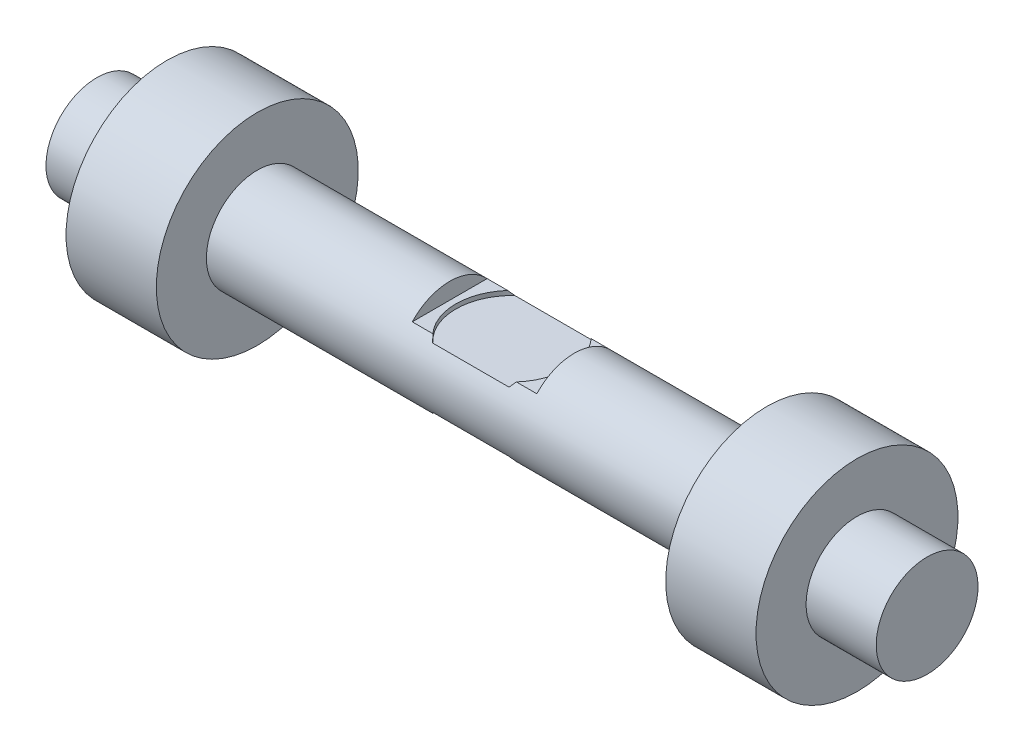
ISO-10303-21;
HEADER;
FILE_DESCRIPTION(('STEP AP214'),'2;1');
FILE_NAME('part.step','',(''),(''),'','','');
FILE_SCHEMA(('AUTOMOTIVE_DESIGN { 1 0 10303 214 1 1 1 1 }'));
ENDSEC;
DATA;
#1=APPLICATION_CONTEXT('core data for automotive mechanical design processes');
#2=APPLICATION_PROTOCOL_DEFINITION('international standard','automotive_design',2000,#1);
#3=PRODUCT_CONTEXT('',#1,'mechanical');
#4=PRODUCT('Part','Part','',(#3));
#5=PRODUCT_RELATED_PRODUCT_CATEGORY('part','',(#4));
#6=PRODUCT_DEFINITION_FORMATION('','',#4);
#7=PRODUCT_DEFINITION_CONTEXT('part definition',#1,'design');
#8=PRODUCT_DEFINITION('design','',#6,#7);
#9=PRODUCT_DEFINITION_SHAPE('','',#8);
#10=(LENGTH_UNIT() NAMED_UNIT(*) SI_UNIT(.MILLI.,.METRE.));
#11=(NAMED_UNIT(*) PLANE_ANGLE_UNIT() SI_UNIT($,.RADIAN.));
#12=(NAMED_UNIT(*) SI_UNIT($,.STERADIAN.) SOLID_ANGLE_UNIT());
#13=UNCERTAINTY_MEASURE_WITH_UNIT(LENGTH_MEASURE(1.E-05),#10,'distance_accuracy_value','');
#14=(GEOMETRIC_REPRESENTATION_CONTEXT(3) GLOBAL_UNCERTAINTY_ASSIGNED_CONTEXT((#13)) GLOBAL_UNIT_ASSIGNED_CONTEXT((#10,
#11,#12)) REPRESENTATION_CONTEXT('',''));
#15=CARTESIAN_POINT('',(0.,0.,0.));
#16=DIRECTION('',(0.,0.,1.));
#17=DIRECTION('',(1.,0.,0.));
#18=AXIS2_PLACEMENT_3D('',#15,#16,#17);
#19=CARTESIAN_POINT('',(0.,0.,0.));
#20=DIRECTION('',(-1.,0.,0.));
#21=DIRECTION('',(0.,-1.,0.));
#22=AXIS2_PLACEMENT_3D('',#19,#20,#21);
#23=CYLINDRICAL_SURFACE('',#22,113.414392954257);
#24=DIRECTION('',(-1.,0.,0.));
#25=VECTOR('',#24,1.);
#26=CARTESIAN_POINT('',(0.,66.8287859085139,-91.6337159738528));
#27=LINE('',#26,#25);
#28=CARTESIAN_POINT('',(1010.01918663939,66.8287859085139,-91.6337159738528));
#29=VERTEX_POINT('',#28);
#30=CARTESIAN_POINT('',(839.980813360611,66.8287859085139,-91.6337159738528));
#31=VERTEX_POINT('',#30);
#32=EDGE_CURVE('E186',#29,#31,#27,.T.);
#33=ORIENTED_EDGE('',*,*,#32,.F.);
#34=CARTESIAN_POINT('',(1010.01918663939,66.8287859085139,-91.6337159738528));
#35=CARTESIAN_POINT('',(1010.70074605879,67.6958340397092,-91.0013608827416));
#36=CARTESIAN_POINT('',(1011.38087128465,68.5546652816579,-90.3561740734483));
#37=CARTESIAN_POINT('',(1012.73653346026,70.2551641641185,-89.0403960319995));
#38=CARTESIAN_POINT('',(1013.41207296136,71.0968419788035,-88.36982057554));
#39=CARTESIAN_POINT('',(1014.75768373868,72.7633690570592,-87.0027479676869));
#40=CARTESIAN_POINT('',(1015.42775498868,73.5882182400087,-86.3062506921544));
#41=CARTESIAN_POINT('',(1016.76158655734,75.2212380756068,-84.8867509976823));
#42=CARTESIAN_POINT('',(1017.42534276375,76.0293982145586,-84.1637326220982));
#43=CARTESIAN_POINT('',(1018.08511059774,76.8287859085139,-83.4275864747773));
#44=B_SPLINE_CURVE_WITH_KNOTS('',3,(#34,#35,#36,#37,#38,#39,#40,#41,#42,#43),.UNSPECIFIED.,.F.,
.F.,(4,2,2,2,4),(0.,3.81378045027927,7.6252288269236,11.4366954588224,15.2504941682873),.UNSPECIFIED.);
#45=CARTESIAN_POINT('',(1018.08511059774,76.8287859085139,-83.4275864747773));
#46=VERTEX_POINT('',#45);
#47=EDGE_CURVE('E258',#29,#46,#44,.T.);
#48=ORIENTED_EDGE('',*,*,#47,.T.);
#49=DIRECTION('',(-1.,0.,0.));
#50=VECTOR('',#49,1.);
#51=CARTESIAN_POINT('',(0.,76.8287859085139,-83.4275864747773));
#52=LINE('',#51,#50);
#53=CARTESIAN_POINT('',(1063.77551020408,76.8287859085139,-83.4275864747773));
#54=VERTEX_POINT('',#53);
#55=EDGE_CURVE('E217',#46,#54,#52,.F.);
#56=ORIENTED_EDGE('',*,*,#55,.T.);
#57=CARTESIAN_POINT('',(1063.77551020408,0.,0.));
#58=DIRECTION('',(1.,0.,0.));
#59=DIRECTION('',(0.,0.,-1.));
#60=AXIS2_PLACEMENT_3D('',#57,#58,#59);
#61=CIRCLE('',#60,113.414392954257);
#62=CARTESIAN_POINT('',(1063.77551020408,76.8287859085139,83.4275864747773));
#63=VERTEX_POINT('',#62);
#64=EDGE_CURVE('E211',#54,#63,#61,.T.);
#65=ORIENTED_EDGE('',*,*,#64,.T.);
#66=DIRECTION('',(-1.,0.,0.));
#67=VECTOR('',#66,1.);
#68=CARTESIAN_POINT('',(0.,76.8287859085139,83.4275864747773));
#69=LINE('',#68,#67);
#70=CARTESIAN_POINT('',(1018.08511059774,76.8287859085139,83.4275864747773));
#71=VERTEX_POINT('',#70);
#72=EDGE_CURVE('E204',#63,#71,#69,.T.);
#73=ORIENTED_EDGE('',*,*,#72,.T.);
#74=CARTESIAN_POINT('',(1018.08511059774,76.8287859085139,83.4275864747773));
#75=CARTESIAN_POINT('',(1017.42534276375,76.0293982145586,84.1637326220982));
#76=CARTESIAN_POINT('',(1016.76158655734,75.2212380756068,84.8867509976823));
#77=CARTESIAN_POINT('',(1015.42775498868,73.5882182400088,86.3062506921544));
#78=CARTESIAN_POINT('',(1014.75768373868,72.7633690570592,87.0027479676868));
#79=CARTESIAN_POINT('',(1013.41207296136,71.0968419788035,88.36982057554));
#80=CARTESIAN_POINT('',(1012.73653346026,70.2551641641185,89.0403960319994));
#81=CARTESIAN_POINT('',(1011.38087128465,68.5546652816579,90.3561740734483));
#82=CARTESIAN_POINT('',(1010.70074605879,67.6958340397092,91.0013608827416));
#83=CARTESIAN_POINT('',(1010.01918663939,66.8287859085139,91.6337159738527));
#84=B_SPLINE_CURVE_WITH_KNOTS('',3,(#74,#75,#76,#77,#78,#79,#80,#81,#82,#83),.UNSPECIFIED.,.F.,
.F.,(4,2,2,2,4),(0.,3.81379870946459,7.62526534136366,11.436713718008,15.2504941682872),.UNSPECIFIED.);
#85=CARTESIAN_POINT('',(1010.01918663939,66.8287859085139,91.6337159738528));
#86=VERTEX_POINT('',#85);
#87=EDGE_CURVE('E282',#71,#86,#84,.T.);
#88=ORIENTED_EDGE('',*,*,#87,.T.);
#89=DIRECTION('',(-1.,0.,0.));
#90=VECTOR('',#89,1.);
#91=CARTESIAN_POINT('',(0.,66.8287859085139,91.6337159738528));
#92=LINE('',#91,#90);
#93=CARTESIAN_POINT('',(839.980813360611,66.8287859085139,91.6337159738528));
#94=VERTEX_POINT('',#93);
#95=EDGE_CURVE('E190',#94,#86,#92,.F.);
#96=ORIENTED_EDGE('',*,*,#95,.F.);
#97=CARTESIAN_POINT('',(839.980813360611,66.8287859085139,91.6337159738528));
#98=CARTESIAN_POINT('',(839.299253941214,67.6958340397091,91.0013608827417));
#99=CARTESIAN_POINT('',(838.619128715354,68.5546652816579,90.3561740734483));
#100=CARTESIAN_POINT('',(837.263466539745,70.2551641641185,89.0403960319995));
#101=CARTESIAN_POINT('',(836.587927038638,71.0968419788035,88.36982057554));
#102=CARTESIAN_POINT('',(835.24231626132,72.7633690570592,87.0027479676868));
#103=CARTESIAN_POINT('',(834.572245011316,73.5882182400088,86.3062506921544));
#104=CARTESIAN_POINT('',(833.238413442657,75.2212380756068,84.8867509976823));
#105=CARTESIAN_POINT('',(832.574657236253,76.0293982145586,84.1637326220982));
#106=CARTESIAN_POINT('',(831.91488940226,76.8287859085139,83.4275864747773));
#107=B_SPLINE_CURVE_WITH_KNOTS('',3,(#97,#98,#99,#100,#101,#102,#103,#104,#105,#106),
.UNSPECIFIED.,.F.,.F.,(4,2,2,2,4),(0.,3.81378045027925,7.62522882692358,11.4366954588227,
15.2504941682874),.UNSPECIFIED.);
#108=CARTESIAN_POINT('',(831.91488940226,76.8287859085139,83.4275864747773));
#109=VERTEX_POINT('',#108);
#110=EDGE_CURVE('E266',#94,#109,#107,.T.);
#111=ORIENTED_EDGE('',*,*,#110,.T.);
#112=CARTESIAN_POINT('',(786.224489795919,76.8287859085139,83.4275864747773));
#113=VERTEX_POINT('',#112);
#114=EDGE_CURVE('E207',#109,#113,#69,.T.);
#115=ORIENTED_EDGE('',*,*,#114,.T.);
#116=CARTESIAN_POINT('',(786.224489795919,0.,0.));
#117=DIRECTION('',(-1.,0.,0.));
#118=DIRECTION('',(0.,0.,1.));
#119=AXIS2_PLACEMENT_3D('',#116,#117,#118);
#120=CIRCLE('',#119,113.414392954257);
#121=CARTESIAN_POINT('',(786.224489795919,76.8287859085139,-83.4275864747773));
#122=VERTEX_POINT('',#121);
#123=EDGE_CURVE('E208',#113,#122,#120,.T.);
#124=ORIENTED_EDGE('',*,*,#123,.T.);
#125=CARTESIAN_POINT('',(831.91488940226,76.8287859085139,-83.4275864747773));
#126=VERTEX_POINT('',#125);
#127=EDGE_CURVE('E214',#122,#126,#52,.F.);
#128=ORIENTED_EDGE('',*,*,#127,.T.);
#129=CARTESIAN_POINT('',(831.91488940226,76.8287859085139,-83.4275864747773));
#130=CARTESIAN_POINT('',(832.574657236254,76.0293982145585,-84.1637326220983));
#131=CARTESIAN_POINT('',(833.238413442657,75.2212380756067,-84.8867509976824));
#132=CARTESIAN_POINT('',(834.572245011316,73.5882182400086,-86.3062506921545));
#133=CARTESIAN_POINT('',(835.24231626132,72.7633690570591,-87.0027479676869));
#134=CARTESIAN_POINT('',(836.587927038638,71.0968419788035,-88.3698205755401));
#135=CARTESIAN_POINT('',(837.263466539745,70.2551641641184,-89.0403960319996));
#136=CARTESIAN_POINT('',(838.619128715354,68.5546652816578,-90.3561740734484));
#137=CARTESIAN_POINT('',(839.299253941214,67.695834039709,-91.0013608827417));
#138=CARTESIAN_POINT('',(839.980813360611,66.8287859085138,-91.6337159738528));
#139=B_SPLINE_CURVE_WITH_KNOTS('',3,(#129,#130,#131,#132,#133,#134,#135,#136,#137,#138),
.UNSPECIFIED.,.F.,.F.,(4,2,2,2,4),(0.,3.8137987094648,7.62526534136389,11.4367137180082,
15.2504941682874),.UNSPECIFIED.);
#140=EDGE_CURVE('E56',#126,#31,#139,.T.);
#141=ORIENTED_EDGE('',*,*,#140,.T.);
#142=EDGE_LOOP('',(#33,#48,#56,#65,#73,#88,#96,#111,#115,#124,#128,#141));
#143=FACE_BOUND('',#142,.T.);
#144=CARTESIAN_POINT('',(357.447453169857,0.,0.));
#145=DIRECTION('',(-1.,0.,0.));
#146=DIRECTION('',(0.,-1.,0.));
#147=AXIS2_PLACEMENT_3D('',#144,#145,#146);
#148=CIRCLE('',#147,113.414392954257);
#149=CARTESIAN_POINT('',(357.447453169857,-113.414392954257,0.));
#150=VERTEX_POINT('',#149);
#151=EDGE_CURVE('E230',#150,#150,#148,.T.);
#152=ORIENTED_EDGE('',*,*,#151,.F.);
#153=EDGE_LOOP('',(#152));
#154=FACE_BOUND('',#153,.T.);
#155=CARTESIAN_POINT('',(1492.55254683014,0.,0.));
#156=DIRECTION('',(-1.,0.,0.));
#157=DIRECTION('',(0.,-1.,0.));
#158=AXIS2_PLACEMENT_3D('',#155,#156,#157);
#159=CIRCLE('',#158,113.414392954257);
#160=CARTESIAN_POINT('',(1492.55254683014,-113.414392954257,0.));
#161=VERTEX_POINT('',#160);
#162=EDGE_CURVE('E233',#161,#161,#159,.T.);
#163=ORIENTED_EDGE('',*,*,#162,.T.);
#164=EDGE_LOOP('',(#163));
#165=FACE_BOUND('',#164,.T.);
#166=CARTESIAN_POINT('',(839.980813360611,-66.8287859085139,91.6337159738528));
#167=CARTESIAN_POINT('',(839.299253941214,-67.6958340397091,91.0013608827417));
#168=CARTESIAN_POINT('',(838.619128715354,-68.5546652816579,90.3561740734483));
#169=CARTESIAN_POINT('',(837.263466539745,-70.2551641641185,89.0403960319995));
#170=CARTESIAN_POINT('',(836.587927038638,-71.0968419788035,88.36982057554));
#171=CARTESIAN_POINT('',(835.24231626132,-72.7633690570592,87.0027479676868));
#172=CARTESIAN_POINT('',(834.572245011316,-73.5882182400088,86.3062506921544));
#173=CARTESIAN_POINT('',(833.238413442657,-75.2212380756068,84.8867509976823));
#174=CARTESIAN_POINT('',(832.574657236253,-76.0293982145586,84.1637326220982));
#175=CARTESIAN_POINT('',(831.91488940226,-76.8287859085139,83.4275864747773));
#176=B_SPLINE_CURVE_WITH_KNOTS('',3,(#166,#167,#168,#169,#170,#171,#172,#173,#174,#175),
.UNSPECIFIED.,.F.,.F.,(4,2,2,2,4),(0.,3.81378045027925,7.62522882692358,11.4366954588227,
15.2504941682874),.UNSPECIFIED.);
#177=CARTESIAN_POINT('',(839.980813360611,-66.8287859085139,91.6337159738528));
#178=VERTEX_POINT('',#177);
#179=CARTESIAN_POINT('',(831.91488940226,-76.8287859085139,83.4275864747773));
#180=VERTEX_POINT('',#179);
#181=EDGE_CURVE('E140',#178,#180,#176,.T.);
#182=ORIENTED_EDGE('',*,*,#181,.F.);
#183=DIRECTION('',(-1.,0.,0.));
#184=VECTOR('',#183,1.);
#185=CARTESIAN_POINT('',(0.,-66.8287859085139,91.6337159738528));
#186=LINE('',#185,#184);
#187=CARTESIAN_POINT('',(1010.01918663939,-66.8287859085139,91.6337159738528));
#188=VERTEX_POINT('',#187);
#189=EDGE_CURVE('E11',#188,#178,#186,.T.);
#190=ORIENTED_EDGE('',*,*,#189,.F.);
#191=CARTESIAN_POINT('',(1018.08511059774,-76.8287859085139,83.4275864747773));
#192=CARTESIAN_POINT('',(1017.42534276375,-76.0293982145586,84.1637326220982));
#193=CARTESIAN_POINT('',(1016.76158655734,-75.2212380756068,84.8867509976823));
#194=CARTESIAN_POINT('',(1015.42775498868,-73.5882182400088,86.3062506921544));
#195=CARTESIAN_POINT('',(1014.75768373868,-72.7633690570592,87.0027479676868));
#196=CARTESIAN_POINT('',(1013.41207296136,-71.0968419788036,88.36982057554));
#197=CARTESIAN_POINT('',(1012.73653346026,-70.2551641641185,89.0403960319994));
#198=CARTESIAN_POINT('',(1011.38087128465,-68.5546652816579,90.3561740734483));
#199=CARTESIAN_POINT('',(1010.70074605879,-67.6958340397092,91.0013608827416));
#200=CARTESIAN_POINT('',(1010.01918663939,-66.8287859085139,91.6337159738527));
#201=B_SPLINE_CURVE_WITH_KNOTS('',3,(#191,#192,#193,#194,#195,#196,#197,#198,#199,#200),
.UNSPECIFIED.,.F.,.F.,(4,2,2,2,4),(0.,3.81379870946457,7.62526534136364,11.436713718008,
15.2504941682872),.UNSPECIFIED.);
#202=CARTESIAN_POINT('',(1018.08511059774,-76.8287859085139,83.4275864747773));
#203=VERTEX_POINT('',#202);
#204=EDGE_CURVE('E121',#203,#188,#201,.T.);
#205=ORIENTED_EDGE('',*,*,#204,.F.);
#206=DIRECTION('',(-1.,0.,0.));
#207=VECTOR('',#206,1.);
#208=CARTESIAN_POINT('',(0.,-76.8287859085139,83.4275864747773));
#209=LINE('',#208,#207);
#210=CARTESIAN_POINT('',(1063.77551020408,-76.8287859085139,83.4275864747773));
#211=VERTEX_POINT('',#210);
#212=EDGE_CURVE('E203',#203,#211,#209,.F.);
#213=ORIENTED_EDGE('',*,*,#212,.T.);
#214=CARTESIAN_POINT('',(1063.77551020408,0.,0.));
#215=DIRECTION('',(1.,0.,0.));
#216=DIRECTION('',(0.,0.,-1.));
#217=AXIS2_PLACEMENT_3D('',#214,#215,#216);
#218=CIRCLE('',#217,113.414392954257);
#219=CARTESIAN_POINT('',(1063.77551020408,-76.8287859085139,-83.4275864747773));
#220=VERTEX_POINT('',#219);
#221=EDGE_CURVE('E197',#211,#220,#218,.T.);
#222=ORIENTED_EDGE('',*,*,#221,.T.);
#223=DIRECTION('',(-1.,0.,0.));
#224=VECTOR('',#223,1.);
#225=CARTESIAN_POINT('',(0.,-76.8287859085139,-83.4275864747773));
#226=LINE('',#225,#224);
#227=CARTESIAN_POINT('',(1018.08511059774,-76.8287859085139,-83.4275864747773));
#228=VERTEX_POINT('',#227);
#229=EDGE_CURVE('E194',#220,#228,#226,.T.);
#230=ORIENTED_EDGE('',*,*,#229,.T.);
#231=CARTESIAN_POINT('',(1010.01918663939,-66.8287859085139,-91.6337159738528));
#232=CARTESIAN_POINT('',(1010.70074605879,-67.6958340397092,-91.0013608827417));
#233=CARTESIAN_POINT('',(1011.38087128465,-68.5546652816579,-90.3561740734483));
#234=CARTESIAN_POINT('',(1012.73653346026,-70.2551641641185,-89.0403960319995));
#235=CARTESIAN_POINT('',(1013.41207296136,-71.0968419788035,-88.36982057554));
#236=CARTESIAN_POINT('',(1014.75768373868,-72.7633690570592,-87.0027479676868));
#237=CARTESIAN_POINT('',(1015.42775498868,-73.5882182400088,-86.3062506921544));
#238=CARTESIAN_POINT('',(1016.76158655734,-75.2212380756068,-84.8867509976823));
#239=CARTESIAN_POINT('',(1017.42534276375,-76.0293982145586,-84.1637326220982));
#240=CARTESIAN_POINT('',(1018.08511059774,-76.8287859085139,-83.4275864747773));
#241=B_SPLINE_CURVE_WITH_KNOTS('',3,(#231,#232,#233,#234,#235,#236,#237,#238,#239,#240),
.UNSPECIFIED.,.F.,.F.,(4,2,2,2,4),(0.,3.81378045027928,7.62522882692361,11.4366954588227,
15.2504941682873),.UNSPECIFIED.);
#242=CARTESIAN_POINT('',(1010.01918663939,-66.8287859085139,-91.6337159738528));
#243=VERTEX_POINT('',#242);
#244=EDGE_CURVE('E48',#243,#228,#241,.T.);
#245=ORIENTED_EDGE('',*,*,#244,.F.);
#246=DIRECTION('',(-1.,0.,0.));
#247=VECTOR('',#246,1.);
#248=CARTESIAN_POINT('',(0.,-66.8287859085139,-91.6337159738528));
#249=LINE('',#248,#247);
#250=CARTESIAN_POINT('',(839.980813360611,-66.8287859085139,-91.6337159738528));
#251=VERTEX_POINT('',#250);
#252=EDGE_CURVE('E41',#251,#243,#249,.F.);
#253=ORIENTED_EDGE('',*,*,#252,.F.);
#254=CARTESIAN_POINT('',(831.91488940226,-76.8287859085139,-83.4275864747773));
#255=CARTESIAN_POINT('',(832.574657236254,-76.0293982145585,-84.1637326220983));
#256=CARTESIAN_POINT('',(833.238413442657,-75.2212380756067,-84.8867509976824));
#257=CARTESIAN_POINT('',(834.572245011316,-73.5882182400086,-86.3062506921545));
#258=CARTESIAN_POINT('',(835.24231626132,-72.7633690570591,-87.0027479676869));
#259=CARTESIAN_POINT('',(836.587927038638,-71.0968419788035,-88.3698205755401));
#260=CARTESIAN_POINT('',(837.263466539745,-70.2551641641184,-89.0403960319996));
#261=CARTESIAN_POINT('',(838.619128715354,-68.5546652816578,-90.3561740734484));
#262=CARTESIAN_POINT('',(839.299253941214,-67.695834039709,-91.0013608827417));
#263=CARTESIAN_POINT('',(839.980813360611,-66.8287859085138,-91.6337159738528));
#264=B_SPLINE_CURVE_WITH_KNOTS('',3,(#254,#255,#256,#257,#258,#259,#260,#261,#262,#263),
.UNSPECIFIED.,.F.,.F.,(4,2,2,2,4),(0.,3.8137987094648,7.62526534136389,11.4367137180082,
15.2504941682874),.UNSPECIFIED.);
#265=CARTESIAN_POINT('',(831.91488940226,-76.8287859085139,-83.4275864747773));
#266=VERTEX_POINT('',#265);
#267=EDGE_CURVE('E129',#266,#251,#264,.T.);
#268=ORIENTED_EDGE('',*,*,#267,.F.);
#269=CARTESIAN_POINT('',(786.224489795919,-76.8287859085139,-83.4275864747773));
#270=VERTEX_POINT('',#269);
#271=EDGE_CURVE('E196',#266,#270,#226,.T.);
#272=ORIENTED_EDGE('',*,*,#271,.T.);
#273=CARTESIAN_POINT('',(786.224489795919,0.,0.));
#274=DIRECTION('',(-1.,0.,0.));
#275=DIRECTION('',(0.,0.,1.));
#276=AXIS2_PLACEMENT_3D('',#273,#274,#275);
#277=CIRCLE('',#276,113.414392954257);
#278=CARTESIAN_POINT('',(786.224489795919,-76.8287859085139,83.4275864747773));
#279=VERTEX_POINT('',#278);
#280=EDGE_CURVE('E200',#270,#279,#277,.T.);
#281=ORIENTED_EDGE('',*,*,#280,.T.);
#282=EDGE_CURVE('E142',#279,#180,#209,.F.);
#283=ORIENTED_EDGE('',*,*,#282,.T.);
#284=EDGE_LOOP('',(#182,#190,#205,#213,#222,#230,#245,#253,#268,#272,#281,#283));
#285=FACE_BOUND('',#284,.T.);
#286=ADVANCED_FACE('F33',(#143,#154,#165,#285),#23,.T.);
#287=CARTESIAN_POINT('',(1063.77551020408,-76.8287859085139,-225.));
#288=DIRECTION('',(0.,1.,0.));
#289=DIRECTION('',(0.,0.,1.));
#290=AXIS2_PLACEMENT_3D('',#287,#288,#289);
#291=PLANE('',#290);
#292=CARTESIAN_POINT('',(925.,-76.8287859085139,0.));
#293=DIRECTION('',(0.,1.,0.));
#294=DIRECTION('',(0.,0.,1.));
#295=AXIS2_PLACEMENT_3D('',#292,#293,#294);
#296=CIRCLE('',#295,125.);
#297=EDGE_CURVE('E185',#180,#266,#296,.F.);
#298=ORIENTED_EDGE('',*,*,#297,.F.);
#299=ORIENTED_EDGE('',*,*,#282,.F.);
#300=DIRECTION('',(0.,0.,1.));
#301=VECTOR('',#300,1.);
#302=CARTESIAN_POINT('',(786.224489795919,-76.8287859085139,-225.));
#303=LINE('',#302,#301);
#304=EDGE_CURVE('E252',#270,#279,#303,.T.);
#305=ORIENTED_EDGE('',*,*,#304,.F.);
#306=ORIENTED_EDGE('',*,*,#271,.F.);
#307=EDGE_LOOP('',(#298,#299,#305,#306));
#308=FACE_BOUND('',#307,.T.);
#309=ADVANCED_FACE('F323',(#308),#291,.F.);
#310=CARTESIAN_POINT('',(925.,-76.8287859085139,0.));
#311=DIRECTION('',(0.,1.,0.));
#312=DIRECTION('',(0.,0.,1.));
#313=AXIS2_PLACEMENT_3D('',#310,#311,#312);
#314=CIRCLE('',#313,125.);
#315=EDGE_CURVE('E125',#203,#228,#314,.T.);
#316=ORIENTED_EDGE('',*,*,#315,.T.);
#317=ORIENTED_EDGE('',*,*,#229,.F.);
#318=DIRECTION('',(0.,0.,1.));
#319=VECTOR('',#318,1.);
#320=CARTESIAN_POINT('',(1063.77551020408,-76.8287859085139,-225.));
#321=LINE('',#320,#319);
#322=EDGE_CURVE('E255',#220,#211,#321,.T.);
#323=ORIENTED_EDGE('',*,*,#322,.T.);
#324=ORIENTED_EDGE('',*,*,#212,.F.);
#325=EDGE_LOOP('',(#316,#317,#323,#324));
#326=FACE_BOUND('',#325,.T.);
#327=ADVANCED_FACE('F329',(#326),#291,.F.);
#328=CARTESIAN_POINT('',(1063.77551020408,76.8287859085139,-225.));
#329=DIRECTION('',(0.,-1.,0.));
#330=DIRECTION('',(0.,0.,-1.));
#331=AXIS2_PLACEMENT_3D('',#328,#329,#330);
#332=PLANE('',#331);
#333=ORIENTED_EDGE('',*,*,#55,.F.);
#334=CARTESIAN_POINT('',(925.,76.8287859085139,0.));
#335=DIRECTION('',(0.,1.,0.));
#336=DIRECTION('',(0.,0.,1.));
#337=AXIS2_PLACEMENT_3D('',#334,#335,#336);
#338=CIRCLE('',#337,125.);
#339=EDGE_CURVE('E145',#71,#46,#338,.T.);
#340=ORIENTED_EDGE('',*,*,#339,.F.);
#341=ORIENTED_EDGE('',*,*,#72,.F.);
#342=DIRECTION('',(0.,0.,1.));
#343=VECTOR('',#342,1.);
#344=CARTESIAN_POINT('',(1063.77551020408,76.8287859085139,-225.));
#345=LINE('',#344,#343);
#346=EDGE_CURVE('E248',#54,#63,#345,.T.);
#347=ORIENTED_EDGE('',*,*,#346,.F.);
#348=EDGE_LOOP('',(#333,#340,#341,#347));
#349=FACE_BOUND('',#348,.T.);
#350=ADVANCED_FACE('F333',(#349),#332,.F.);
#351=CARTESIAN_POINT('',(0.,0.,0.));
#352=DIRECTION('',(1.,0.,0.));
#353=DIRECTION('',(0.,1.,0.));
#354=AXIS2_PLACEMENT_3D('',#351,#352,#353);
#355=PLANE('',#354);
#356=CARTESIAN_POINT('',(0.,0.,0.));
#357=DIRECTION('',(-1.,0.,0.));
#358=DIRECTION('',(0.,-1.,0.));
#359=AXIS2_PLACEMENT_3D('',#356,#357,#358);
#360=CIRCLE('',#359,113.414392954257);
#361=CARTESIAN_POINT('',(0.,-113.414392954257,0.));
#362=VERTEX_POINT('',#361);
#363=EDGE_CURVE('E218',#362,#362,#360,.T.);
#364=ORIENTED_EDGE('',*,*,#363,.T.);
#365=EDGE_LOOP('',(#364));
#366=FACE_BOUND('',#365,.T.);
#367=ADVANCED_FACE('F35',(#366),#355,.F.);
#368=CARTESIAN_POINT('',(0.,0.,0.));
#369=DIRECTION('',(-1.,0.,0.));
#370=DIRECTION('',(0.,-1.,0.));
#371=AXIS2_PLACEMENT_3D('',#368,#369,#370);
#372=CYLINDRICAL_SURFACE('',#371,113.414392954257);
#373=ORIENTED_EDGE('',*,*,#363,.F.);
#374=EDGE_LOOP('',(#373));
#375=FACE_BOUND('',#374,.T.);
#376=CARTESIAN_POINT('',(156.301438495659,0.,0.));
#377=DIRECTION('',(-1.,0.,0.));
#378=DIRECTION('',(0.,-1.,0.));
#379=AXIS2_PLACEMENT_3D('',#376,#377,#378);
#380=CIRCLE('',#379,113.414392954257);
#381=CARTESIAN_POINT('',(156.301438495659,-113.414392954257,0.));
#382=VERTEX_POINT('',#381);
#383=EDGE_CURVE('E221',#382,#382,#380,.T.);
#384=ORIENTED_EDGE('',*,*,#383,.T.);
#385=EDGE_LOOP('',(#384));
#386=FACE_BOUND('',#385,.T.);
#387=ADVANCED_FACE('F345',(#375,#386),#372,.T.);
#388=CARTESIAN_POINT('',(156.301438495659,113.414392954257,0.));
#389=DIRECTION('',(1.,0.,0.));
#390=DIRECTION('',(0.,1.,0.));
#391=AXIS2_PLACEMENT_3D('',#388,#389,#390);
#392=PLANE('',#391);
#393=ORIENTED_EDGE('',*,*,#383,.F.);
#394=EDGE_LOOP('',(#393));
#395=FACE_BOUND('',#394,.T.);
#396=CARTESIAN_POINT('',(156.301438495659,0.,0.));
#397=DIRECTION('',(-1.,0.,0.));
#398=DIRECTION('',(0.,-1.,0.));
#399=AXIS2_PLACEMENT_3D('',#396,#397,#398);
#400=CIRCLE('',#399,225.);
#401=CARTESIAN_POINT('',(156.301438495659,-225.,0.));
#402=VERTEX_POINT('',#401);
#403=EDGE_CURVE('E224',#402,#402,#400,.T.);
#404=ORIENTED_EDGE('',*,*,#403,.T.);
#405=EDGE_LOOP('',(#404));
#406=FACE_BOUND('',#405,.T.);
#407=ADVANCED_FACE('F354',(#395,#406),#392,.F.);
#408=CARTESIAN_POINT('',(0.,0.,0.));
#409=DIRECTION('',(-1.,0.,0.));
#410=DIRECTION('',(0.,-1.,0.));
#411=AXIS2_PLACEMENT_3D('',#408,#409,#410);
#412=CYLINDRICAL_SURFACE('',#411,225.);
#413=ORIENTED_EDGE('',*,*,#403,.F.);
#414=EDGE_LOOP('',(#413));
#415=FACE_BOUND('',#414,.T.);
#416=CARTESIAN_POINT('',(357.447453169857,0.,0.));
#417=DIRECTION('',(-1.,0.,0.));
#418=DIRECTION('',(0.,-1.,0.));
#419=AXIS2_PLACEMENT_3D('',#416,#417,#418);
#420=CIRCLE('',#419,225.);
#421=CARTESIAN_POINT('',(357.447453169857,-225.,0.));
#422=VERTEX_POINT('',#421);
#423=EDGE_CURVE('E227',#422,#422,#420,.T.);
#424=ORIENTED_EDGE('',*,*,#423,.T.);
#425=EDGE_LOOP('',(#424));
#426=FACE_BOUND('',#425,.T.);
#427=ADVANCED_FACE('F362',(#415,#426),#412,.T.);
#428=CARTESIAN_POINT('',(357.447453169857,225.,0.));
#429=DIRECTION('',(-1.,0.,0.));
#430=DIRECTION('',(0.,-1.,0.));
#431=AXIS2_PLACEMENT_3D('',#428,#429,#430);
#432=PLANE('',#431);
#433=ORIENTED_EDGE('',*,*,#423,.F.);
#434=EDGE_LOOP('',(#433));
#435=FACE_BOUND('',#434,.T.);
#436=ORIENTED_EDGE('',*,*,#151,.T.);
#437=EDGE_LOOP('',(#436));
#438=FACE_BOUND('',#437,.T.);
#439=ADVANCED_FACE('F368',(#435,#438),#432,.F.);
#440=CARTESIAN_POINT('',(1492.55254683014,113.414392954257,0.));
#441=DIRECTION('',(1.,0.,0.));
#442=DIRECTION('',(0.,1.,0.));
#443=AXIS2_PLACEMENT_3D('',#440,#441,#442);
#444=PLANE('',#443);
#445=ORIENTED_EDGE('',*,*,#162,.F.);
#446=EDGE_LOOP('',(#445));
#447=FACE_BOUND('',#446,.T.);
#448=CARTESIAN_POINT('',(1492.55254683014,0.,0.));
#449=DIRECTION('',(-1.,0.,0.));
#450=DIRECTION('',(0.,-1.,0.));
#451=AXIS2_PLACEMENT_3D('',#448,#449,#450);
#452=CIRCLE('',#451,225.);
#453=CARTESIAN_POINT('',(1492.55254683014,-225.,0.));
#454=VERTEX_POINT('',#453);
#455=EDGE_CURVE('E236',#454,#454,#452,.T.);
#456=ORIENTED_EDGE('',*,*,#455,.T.);
#457=EDGE_LOOP('',(#456));
#458=FACE_BOUND('',#457,.T.);
#459=ADVANCED_FACE('F374',(#447,#458),#444,.F.);
#460=CARTESIAN_POINT('',(0.,0.,0.));
#461=DIRECTION('',(-1.,0.,0.));
#462=DIRECTION('',(0.,-1.,0.));
#463=AXIS2_PLACEMENT_3D('',#460,#461,#462);
#464=CYLINDRICAL_SURFACE('',#463,225.);
#465=ORIENTED_EDGE('',*,*,#455,.F.);
#466=EDGE_LOOP('',(#465));
#467=FACE_BOUND('',#466,.T.);
#468=CARTESIAN_POINT('',(1693.69856150434,0.,0.));
#469=DIRECTION('',(-1.,0.,0.));
#470=DIRECTION('',(0.,-1.,0.));
#471=AXIS2_PLACEMENT_3D('',#468,#469,#470);
#472=CIRCLE('',#471,225.);
#473=CARTESIAN_POINT('',(1693.69856150434,-225.,0.));
#474=VERTEX_POINT('',#473);
#475=EDGE_CURVE('E239',#474,#474,#472,.T.);
#476=ORIENTED_EDGE('',*,*,#475,.T.);
#477=EDGE_LOOP('',(#476));
#478=FACE_BOUND('',#477,.T.);
#479=ADVANCED_FACE('F381',(#467,#478),#464,.T.);
#480=CARTESIAN_POINT('',(1693.69856150434,225.,0.));
#481=DIRECTION('',(-1.,0.,0.));
#482=DIRECTION('',(0.,-1.,0.));
#483=AXIS2_PLACEMENT_3D('',#480,#481,#482);
#484=PLANE('',#483);
#485=ORIENTED_EDGE('',*,*,#475,.F.);
#486=EDGE_LOOP('',(#485));
#487=FACE_BOUND('',#486,.T.);
#488=CARTESIAN_POINT('',(1693.69856150434,0.,0.));
#489=DIRECTION('',(-1.,0.,0.));
#490=DIRECTION('',(0.,-1.,0.));
#491=AXIS2_PLACEMENT_3D('',#488,#489,#490);
#492=CIRCLE('',#491,113.414392954257);
#493=CARTESIAN_POINT('',(1693.69856150434,-113.414392954257,0.));
#494=VERTEX_POINT('',#493);
#495=EDGE_CURVE('E242',#494,#494,#492,.T.);
#496=ORIENTED_EDGE('',*,*,#495,.T.);
#497=EDGE_LOOP('',(#496));
#498=FACE_BOUND('',#497,.T.);
#499=ADVANCED_FACE('F386',(#487,#498),#484,.F.);
#500=CARTESIAN_POINT('',(0.,0.,0.));
#501=DIRECTION('',(-1.,0.,0.));
#502=DIRECTION('',(0.,-1.,0.));
#503=AXIS2_PLACEMENT_3D('',#500,#501,#502);
#504=CYLINDRICAL_SURFACE('',#503,113.414392954257);
#505=ORIENTED_EDGE('',*,*,#495,.F.);
#506=EDGE_LOOP('',(#505));
#507=FACE_BOUND('',#506,.T.);
#508=CARTESIAN_POINT('',(1850.,0.,0.));
#509=DIRECTION('',(-1.,0.,0.));
#510=DIRECTION('',(0.,-1.,0.));
#511=AXIS2_PLACEMENT_3D('',#508,#509,#510);
#512=CIRCLE('',#511,113.414392954257);
#513=CARTESIAN_POINT('',(1850.,-113.414392954257,0.));
#514=VERTEX_POINT('',#513);
#515=EDGE_CURVE('E245',#514,#514,#512,.T.);
#516=ORIENTED_EDGE('',*,*,#515,.T.);
#517=EDGE_LOOP('',(#516));
#518=FACE_BOUND('',#517,.T.);
#519=ADVANCED_FACE('F318',(#507,#518),#504,.T.);
#520=CARTESIAN_POINT('',(1850.,113.414392954257,0.));
#521=DIRECTION('',(-1.,0.,0.));
#522=DIRECTION('',(0.,-1.,0.));
#523=AXIS2_PLACEMENT_3D('',#520,#521,#522);
#524=PLANE('',#523);
#525=ORIENTED_EDGE('',*,*,#515,.F.);
#526=EDGE_LOOP('',(#525));
#527=FACE_BOUND('',#526,.T.);
#528=ADVANCED_FACE('F309',(#527),#524,.F.);
#529=CARTESIAN_POINT('',(786.224489795919,76.8287859085139,-225.));
#530=DIRECTION('',(-1.,0.,0.));
#531=DIRECTION('',(0.,0.,1.));
#532=AXIS2_PLACEMENT_3D('',#529,#530,#531);
#533=PLANE('',#532);
#534=DIRECTION('',(0.,0.,1.));
#535=VECTOR('',#534,1.);
#536=CARTESIAN_POINT('',(786.224489795919,76.8287859085139,-225.));
#537=LINE('',#536,#535);
#538=EDGE_CURVE('E249',#122,#113,#537,.T.);
#539=ORIENTED_EDGE('',*,*,#538,.F.);
#540=ORIENTED_EDGE('',*,*,#123,.F.);
#541=EDGE_LOOP('',(#539,#540));
#542=FACE_BOUND('',#541,.T.);
#543=ADVANCED_FACE('F306',(#542),#533,.F.);
#544=CARTESIAN_POINT('',(1063.77551020408,76.8287859085139,-225.));
#545=DIRECTION('',(1.,0.,0.));
#546=DIRECTION('',(0.,0.,-1.));
#547=AXIS2_PLACEMENT_3D('',#544,#545,#546);
#548=PLANE('',#547);
#549=ORIENTED_EDGE('',*,*,#346,.T.);
#550=ORIENTED_EDGE('',*,*,#64,.F.);
#551=EDGE_LOOP('',(#549,#550));
#552=FACE_BOUND('',#551,.T.);
#553=ADVANCED_FACE('F308',(#552),#548,.F.);
#554=ORIENTED_EDGE('',*,*,#114,.F.);
#555=CARTESIAN_POINT('',(925.,76.8287859085139,0.));
#556=DIRECTION('',(0.,-1.,0.));
#557=DIRECTION('',(0.,0.,-1.));
#558=AXIS2_PLACEMENT_3D('',#555,#556,#557);
#559=CIRCLE('',#558,125.);
#560=EDGE_CURVE('E192',#109,#126,#559,.T.);
#561=ORIENTED_EDGE('',*,*,#560,.T.);
#562=ORIENTED_EDGE('',*,*,#127,.F.);
#563=ORIENTED_EDGE('',*,*,#538,.T.);
#564=EDGE_LOOP('',(#554,#561,#562,#563));
#565=FACE_BOUND('',#564,.T.);
#566=ADVANCED_FACE('F303',(#565),#332,.F.);
#567=CARTESIAN_POINT('',(1063.77551020408,-76.8287859085139,-225.));
#568=DIRECTION('',(1.,0.,0.));
#569=DIRECTION('',(0.,0.,-1.));
#570=AXIS2_PLACEMENT_3D('',#567,#568,#569);
#571=PLANE('',#570);
#572=ORIENTED_EDGE('',*,*,#322,.F.);
#573=ORIENTED_EDGE('',*,*,#221,.F.);
#574=EDGE_LOOP('',(#572,#573));
#575=FACE_BOUND('',#574,.T.);
#576=ADVANCED_FACE('F335',(#575),#571,.F.);
#577=CARTESIAN_POINT('',(786.224489795919,-76.8287859085139,-225.));
#578=DIRECTION('',(-1.,0.,0.));
#579=DIRECTION('',(0.,0.,1.));
#580=AXIS2_PLACEMENT_3D('',#577,#578,#579);
#581=PLANE('',#580);
#582=ORIENTED_EDGE('',*,*,#304,.T.);
#583=ORIENTED_EDGE('',*,*,#280,.F.);
#584=EDGE_LOOP('',(#582,#583));
#585=FACE_BOUND('',#584,.T.);
#586=ADVANCED_FACE('F277',(#585),#581,.F.);
#587=CARTESIAN_POINT('',(925.,66.8287859085139,0.));
#588=DIRECTION('',(0.,1.,0.));
#589=DIRECTION('',(0.,0.,1.));
#590=AXIS2_PLACEMENT_3D('',#587,#588,#589);
#591=PLANE('',#590);
#592=ORIENTED_EDGE('',*,*,#32,.T.);
#593=CARTESIAN_POINT('',(925.,66.8287859085139,0.));
#594=DIRECTION('',(0.,1.,0.));
#595=DIRECTION('',(0.,0.,1.));
#596=AXIS2_PLACEMENT_3D('',#593,#594,#595);
#597=CIRCLE('',#596,125.);
#598=EDGE_CURVE('E147',#31,#94,#597,.T.);
#599=ORIENTED_EDGE('',*,*,#598,.T.);
#600=ORIENTED_EDGE('',*,*,#95,.T.);
#601=EDGE_CURVE('E159',#86,#29,#597,.T.);
#602=ORIENTED_EDGE('',*,*,#601,.T.);
#603=EDGE_LOOP('',(#592,#599,#600,#602));
#604=FACE_BOUND('',#603,.T.);
#605=ADVANCED_FACE('F168',(#604),#591,.T.);
#606=CARTESIAN_POINT('',(925.,66.8287859085139,0.));
#607=DIRECTION('',(0.,1.,0.));
#608=DIRECTION('',(0.,0.,1.));
#609=AXIS2_PLACEMENT_3D('',#606,#607,#608);
#610=CYLINDRICAL_SURFACE('',#609,125.);
#611=ORIENTED_EDGE('',*,*,#601,.F.);
#612=ORIENTED_EDGE('',*,*,#87,.F.);
#613=ORIENTED_EDGE('',*,*,#339,.T.);
#614=ORIENTED_EDGE('',*,*,#47,.F.);
#615=EDGE_LOOP('',(#611,#612,#613,#614));
#616=FACE_BOUND('',#615,.T.);
#617=ADVANCED_FACE('F271',(#616),#610,.F.);
#618=ORIENTED_EDGE('',*,*,#598,.F.);
#619=ORIENTED_EDGE('',*,*,#140,.F.);
#620=ORIENTED_EDGE('',*,*,#560,.F.);
#621=ORIENTED_EDGE('',*,*,#110,.F.);
#622=EDGE_LOOP('',(#618,#619,#620,#621));
#623=FACE_BOUND('',#622,.T.);
#624=ADVANCED_FACE('F275',(#623),#610,.F.);
#625=CARTESIAN_POINT('',(925.,-66.8287859085139,0.));
#626=DIRECTION('',(0.,-1.,0.));
#627=DIRECTION('',(0.,0.,1.));
#628=AXIS2_PLACEMENT_3D('',#625,#626,#627);
#629=PLANE('',#628);
#630=ORIENTED_EDGE('',*,*,#189,.T.);
#631=CARTESIAN_POINT('',(925.,-66.8287859085139,0.));
#632=DIRECTION('',(0.,1.,0.));
#633=DIRECTION('',(0.,0.,1.));
#634=AXIS2_PLACEMENT_3D('',#631,#632,#633);
#635=CIRCLE('',#634,125.);
#636=EDGE_CURVE('E136',#251,#178,#635,.T.);
#637=ORIENTED_EDGE('',*,*,#636,.F.);
#638=ORIENTED_EDGE('',*,*,#252,.T.);
#639=EDGE_CURVE('E124',#188,#243,#635,.T.);
#640=ORIENTED_EDGE('',*,*,#639,.F.);
#641=EDGE_LOOP('',(#630,#637,#638,#640));
#642=FACE_BOUND('',#641,.T.);
#643=ADVANCED_FACE('F132',(#642),#629,.T.);
#644=CARTESIAN_POINT('',(925.,-66.8287859085139,0.));
#645=DIRECTION('',(0.,-1.,0.));
#646=DIRECTION('',(0.,0.,-1.));
#647=AXIS2_PLACEMENT_3D('',#644,#645,#646);
#648=CYLINDRICAL_SURFACE('',#647,125.);
#649=ORIENTED_EDGE('',*,*,#181,.T.);
#650=ORIENTED_EDGE('',*,*,#297,.T.);
#651=ORIENTED_EDGE('',*,*,#267,.T.);
#652=ORIENTED_EDGE('',*,*,#636,.T.);
#653=EDGE_LOOP('',(#649,#650,#651,#652));
#654=FACE_BOUND('',#653,.T.);
#655=ADVANCED_FACE('F163',(#654),#648,.F.);
#656=ORIENTED_EDGE('',*,*,#244,.T.);
#657=ORIENTED_EDGE('',*,*,#315,.F.);
#658=ORIENTED_EDGE('',*,*,#204,.T.);
#659=ORIENTED_EDGE('',*,*,#639,.T.);
#660=EDGE_LOOP('',(#656,#657,#658,#659));
#661=FACE_BOUND('',#660,.T.);
#662=ADVANCED_FACE('F123',(#661),#648,.F.);
#663=CLOSED_SHELL('',(#286,#309,#327,#350,#367,#387,#407,#427,#439,#459,#479,#499,#519,#528,
#543,#553,#566,#576,#586,#605,#617,#624,#643,#655,#662));
#664=MANIFOLD_SOLID_BREP('B2',#663);
#665=ADVANCED_BREP_SHAPE_REPRESENTATION('',(#18,#664),#14);
#666=SHAPE_DEFINITION_REPRESENTATION(#9,#665);
ENDSEC;
END-ISO-10303-21;
